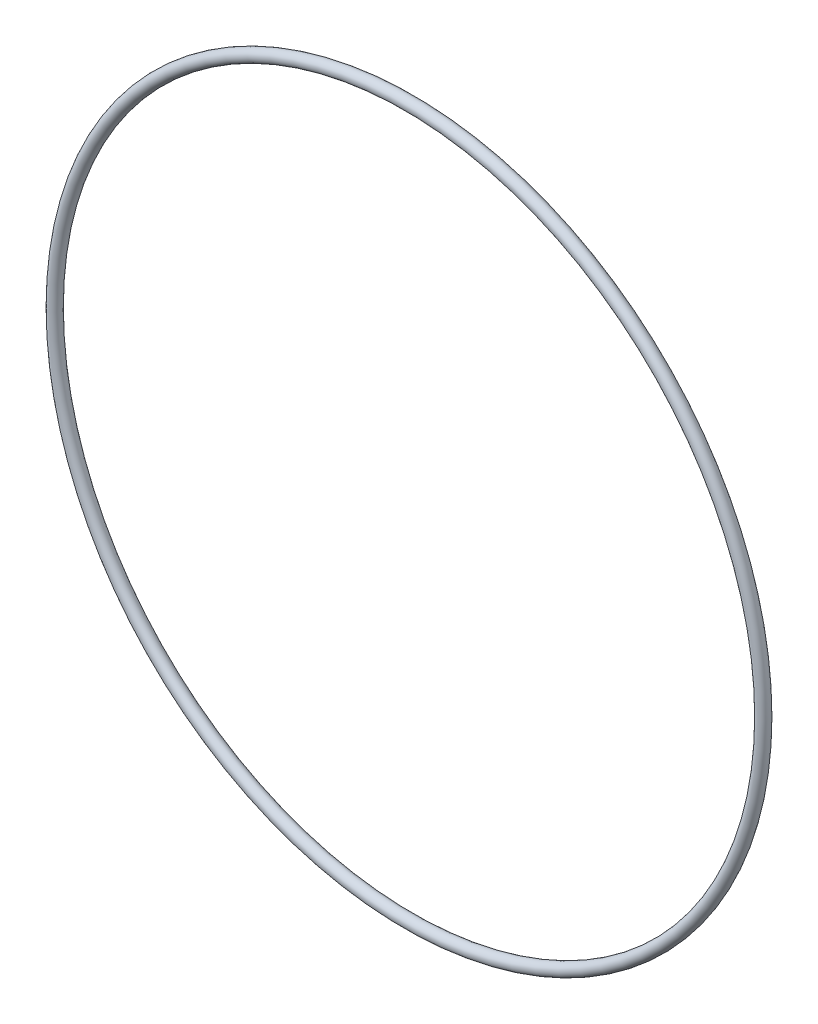
ISO-10303-21;
HEADER;
FILE_DESCRIPTION(('STEP AP214'),'2;1');
FILE_NAME('part.step','',(''),(''),'','','');
FILE_SCHEMA(('AUTOMOTIVE_DESIGN { 1 0 10303 214 1 1 1 1 }'));
ENDSEC;
DATA;
#1=APPLICATION_CONTEXT('core data for automotive mechanical design processes');
#2=APPLICATION_PROTOCOL_DEFINITION('international standard','automotive_design',2000,#1);
#3=PRODUCT_CONTEXT('',#1,'mechanical');
#4=PRODUCT('Part','Part','',(#3));
#5=PRODUCT_RELATED_PRODUCT_CATEGORY('part','',(#4));
#6=PRODUCT_DEFINITION_FORMATION('','',#4);
#7=PRODUCT_DEFINITION_CONTEXT('part definition',#1,'design');
#8=PRODUCT_DEFINITION('design','',#6,#7);
#9=PRODUCT_DEFINITION_SHAPE('','',#8);
#10=(LENGTH_UNIT() NAMED_UNIT(*) SI_UNIT(.MILLI.,.METRE.));
#11=(NAMED_UNIT(*) PLANE_ANGLE_UNIT() SI_UNIT($,.RADIAN.));
#12=(NAMED_UNIT(*) SI_UNIT($,.STERADIAN.) SOLID_ANGLE_UNIT());
#13=UNCERTAINTY_MEASURE_WITH_UNIT(LENGTH_MEASURE(1.E-05),#10,'distance_accuracy_value','');
#14=(GEOMETRIC_REPRESENTATION_CONTEXT(3) GLOBAL_UNCERTAINTY_ASSIGNED_CONTEXT((#13)) GLOBAL_UNIT_ASSIGNED_CONTEXT((#10,
#11,#12)) REPRESENTATION_CONTEXT('',''));
#15=CARTESIAN_POINT('',(0.,0.,0.));
#16=DIRECTION('',(0.,0.,1.));
#17=DIRECTION('',(1.,0.,0.));
#18=AXIS2_PLACEMENT_3D('',#15,#16,#17);
#19=CARTESIAN_POINT('',(0.,0.,0.));
#20=DIRECTION('',(0.,0.,1.));
#21=DIRECTION('',(1.,0.,0.));
#22=AXIS2_PLACEMENT_3D('',#19,#20,#21);
#23=TOROIDAL_SURFACE('',#22,51.5493,0.889000000000003);
#24=CARTESIAN_POINT('',(52.4383,0.,0.));
#25=VERTEX_POINT('',#24);
#26=VERTEX_LOOP('',#25);
#27=FACE_BOUND('',#26,.T.);
#28=ADVANCED_FACE('F33',(#27),#23,.T.);
#29=CLOSED_SHELL('',(#28));
#30=MANIFOLD_SOLID_BREP('B2',#29);
#31=ADVANCED_BREP_SHAPE_REPRESENTATION('',(#18,#30),#14);
#32=SHAPE_DEFINITION_REPRESENTATION(#9,#31);
ENDSEC;
END-ISO-10303-21;
